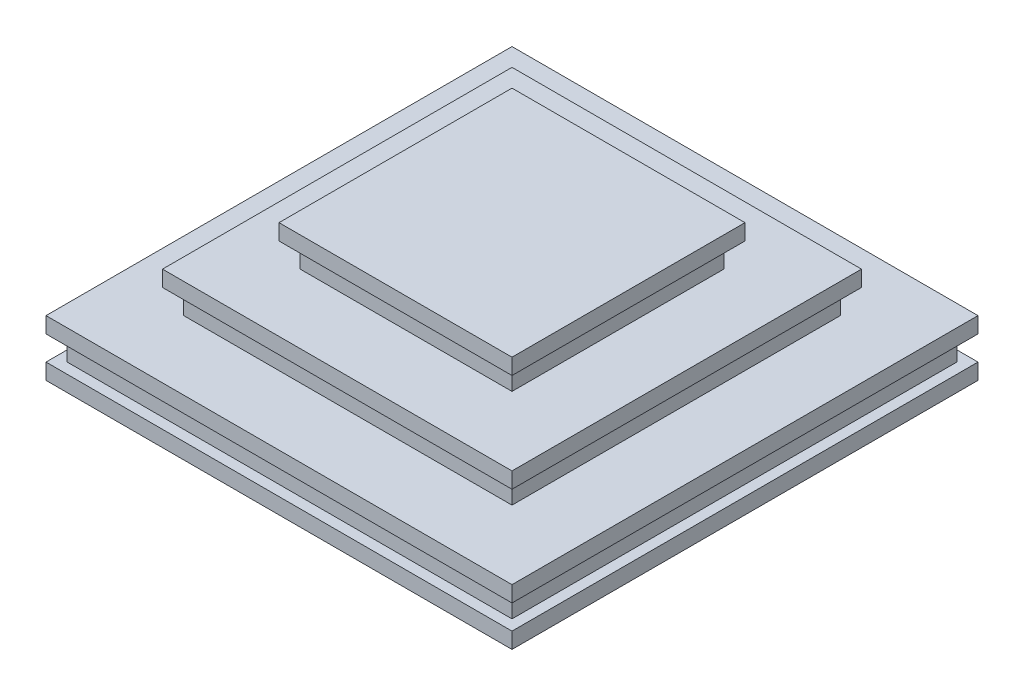
ISO-10303-21;
HEADER;
FILE_DESCRIPTION(('STEP AP214'),'2;1');
FILE_NAME('part.step','',(''),(''),'','','');
FILE_SCHEMA(('AUTOMOTIVE_DESIGN { 1 0 10303 214 1 1 1 1 }'));
ENDSEC;
DATA;
#1=APPLICATION_CONTEXT('core data for automotive mechanical design processes');
#2=APPLICATION_PROTOCOL_DEFINITION('international standard','automotive_design',2000,#1);
#3=PRODUCT_CONTEXT('',#1,'mechanical');
#4=PRODUCT('Part','Part','',(#3));
#5=PRODUCT_RELATED_PRODUCT_CATEGORY('part','',(#4));
#6=PRODUCT_DEFINITION_FORMATION('','',#4);
#7=PRODUCT_DEFINITION_CONTEXT('part definition',#1,'design');
#8=PRODUCT_DEFINITION('design','',#6,#7);
#9=PRODUCT_DEFINITION_SHAPE('','',#8);
#10=(LENGTH_UNIT() NAMED_UNIT(*) SI_UNIT(.MILLI.,.METRE.));
#11=(NAMED_UNIT(*) PLANE_ANGLE_UNIT() SI_UNIT($,.RADIAN.));
#12=(NAMED_UNIT(*) SI_UNIT($,.STERADIAN.) SOLID_ANGLE_UNIT());
#13=UNCERTAINTY_MEASURE_WITH_UNIT(LENGTH_MEASURE(1.E-05),#10,'distance_accuracy_value','');
#14=(GEOMETRIC_REPRESENTATION_CONTEXT(3) GLOBAL_UNCERTAINTY_ASSIGNED_CONTEXT((#13)) GLOBAL_UNIT_ASSIGNED_CONTEXT((#10,
#11,#12)) REPRESENTATION_CONTEXT('',''));
#15=CARTESIAN_POINT('',(0.,0.,0.));
#16=DIRECTION('',(0.,0.,1.));
#17=DIRECTION('',(1.,0.,0.));
#18=AXIS2_PLACEMENT_3D('',#15,#16,#17);
#19=CARTESIAN_POINT('',(-22.,1.5,-22.));
#20=DIRECTION('',(0.,0.,-1.));
#21=DIRECTION('',(-1.,0.,0.));
#22=AXIS2_PLACEMENT_3D('',#19,#20,#21);
#23=PLANE('',#22);
#24=DIRECTION('',(1.,0.,0.));
#25=VECTOR('',#24,1.);
#26=CARTESIAN_POINT('',(-22.,0.,-22.));
#27=LINE('',#26,#25);
#28=CARTESIAN_POINT('',(-22.,0.,-22.));
#29=VERTEX_POINT('',#28);
#30=CARTESIAN_POINT('',(22.,0.,-22.));
#31=VERTEX_POINT('',#30);
#32=EDGE_CURVE('E416',#29,#31,#27,.T.);
#33=ORIENTED_EDGE('',*,*,#32,.F.);
#34=DIRECTION('',(0.,-1.,0.));
#35=VECTOR('',#34,1.);
#36=CARTESIAN_POINT('',(-22.,1.5,-22.));
#37=LINE('',#36,#35);
#38=CARTESIAN_POINT('',(-22.,1.5,-22.));
#39=VERTEX_POINT('',#38);
#40=EDGE_CURVE('E11',#39,#29,#37,.T.);
#41=ORIENTED_EDGE('',*,*,#40,.F.);
#42=DIRECTION('',(1.,0.,0.));
#43=VECTOR('',#42,1.);
#44=CARTESIAN_POINT('',(-22.,1.5,-22.));
#45=LINE('',#44,#43);
#46=CARTESIAN_POINT('',(22.,1.5,-22.));
#47=VERTEX_POINT('',#46);
#48=EDGE_CURVE('E417',#39,#47,#45,.T.);
#49=ORIENTED_EDGE('',*,*,#48,.T.);
#50=DIRECTION('',(0.,-1.,0.));
#51=VECTOR('',#50,1.);
#52=CARTESIAN_POINT('',(22.,1.5,-22.));
#53=LINE('',#52,#51);
#54=EDGE_CURVE('E42',#47,#31,#53,.T.);
#55=ORIENTED_EDGE('',*,*,#54,.T.);
#56=EDGE_LOOP('',(#33,#41,#49,#55));
#57=FACE_BOUND('',#56,.T.);
#58=ADVANCED_FACE('F39',(#57),#23,.T.);
#59=CARTESIAN_POINT('',(-22.,1.5,-22.));
#60=DIRECTION('',(1.,0.,0.));
#61=DIRECTION('',(0.,0.,-1.));
#62=AXIS2_PLACEMENT_3D('',#59,#60,#61);
#63=PLANE('',#62);
#64=DIRECTION('',(0.,0.,1.));
#65=VECTOR('',#64,1.);
#66=CARTESIAN_POINT('',(-22.,0.,-22.));
#67=LINE('',#66,#65);
#68=CARTESIAN_POINT('',(-22.,0.,22.));
#69=VERTEX_POINT('',#68);
#70=EDGE_CURVE('E421',#29,#69,#67,.T.);
#71=ORIENTED_EDGE('',*,*,#70,.T.);
#72=DIRECTION('',(0.,-1.,0.));
#73=VECTOR('',#72,1.);
#74=CARTESIAN_POINT('',(-22.,1.5,22.));
#75=LINE('',#74,#73);
#76=CARTESIAN_POINT('',(-22.,1.5,22.));
#77=VERTEX_POINT('',#76);
#78=EDGE_CURVE('E47',#77,#69,#75,.T.);
#79=ORIENTED_EDGE('',*,*,#78,.F.);
#80=DIRECTION('',(0.,0.,1.));
#81=VECTOR('',#80,1.);
#82=CARTESIAN_POINT('',(-22.,1.5,-22.));
#83=LINE('',#82,#81);
#84=EDGE_CURVE('E426',#39,#77,#83,.T.);
#85=ORIENTED_EDGE('',*,*,#84,.F.);
#86=ORIENTED_EDGE('',*,*,#40,.T.);
#87=EDGE_LOOP('',(#71,#79,#85,#86));
#88=FACE_BOUND('',#87,.T.);
#89=ADVANCED_FACE('F453',(#88),#63,.F.);
#90=CARTESIAN_POINT('',(-22.,1.5,22.));
#91=DIRECTION('',(0.,0.,-1.));
#92=DIRECTION('',(-1.,0.,0.));
#93=AXIS2_PLACEMENT_3D('',#90,#91,#92);
#94=PLANE('',#93);
#95=DIRECTION('',(1.,0.,0.));
#96=VECTOR('',#95,1.);
#97=CARTESIAN_POINT('',(-22.,0.,22.));
#98=LINE('',#97,#96);
#99=CARTESIAN_POINT('',(22.,0.,22.));
#100=VERTEX_POINT('',#99);
#101=EDGE_CURVE('E433',#69,#100,#98,.T.);
#102=ORIENTED_EDGE('',*,*,#101,.T.);
#103=DIRECTION('',(0.,-1.,0.));
#104=VECTOR('',#103,1.);
#105=CARTESIAN_POINT('',(22.,1.5,22.));
#106=LINE('',#105,#104);
#107=CARTESIAN_POINT('',(22.,1.5,22.));
#108=VERTEX_POINT('',#107);
#109=EDGE_CURVE('E438',#108,#100,#106,.T.);
#110=ORIENTED_EDGE('',*,*,#109,.F.);
#111=DIRECTION('',(1.,0.,0.));
#112=VECTOR('',#111,1.);
#113=CARTESIAN_POINT('',(-22.,1.5,22.));
#114=LINE('',#113,#112);
#115=EDGE_CURVE('E424',#77,#108,#114,.T.);
#116=ORIENTED_EDGE('',*,*,#115,.F.);
#117=ORIENTED_EDGE('',*,*,#78,.T.);
#118=EDGE_LOOP('',(#102,#110,#116,#117));
#119=FACE_BOUND('',#118,.T.);
#120=ADVANCED_FACE('F457',(#119),#94,.F.);
#121=CARTESIAN_POINT('',(22.,1.5,-22.));
#122=DIRECTION('',(1.,0.,0.));
#123=DIRECTION('',(0.,0.,-1.));
#124=AXIS2_PLACEMENT_3D('',#121,#122,#123);
#125=PLANE('',#124);
#126=DIRECTION('',(0.,0.,1.));
#127=VECTOR('',#126,1.);
#128=CARTESIAN_POINT('',(22.,0.,-22.));
#129=LINE('',#128,#127);
#130=EDGE_CURVE('E430',#31,#100,#129,.T.);
#131=ORIENTED_EDGE('',*,*,#130,.F.);
#132=ORIENTED_EDGE('',*,*,#54,.F.);
#133=DIRECTION('',(0.,0.,1.));
#134=VECTOR('',#133,1.);
#135=CARTESIAN_POINT('',(22.,1.5,-22.));
#136=LINE('',#135,#134);
#137=EDGE_CURVE('E420',#47,#108,#136,.T.);
#138=ORIENTED_EDGE('',*,*,#137,.T.);
#139=ORIENTED_EDGE('',*,*,#109,.T.);
#140=EDGE_LOOP('',(#131,#132,#138,#139));
#141=FACE_BOUND('',#140,.T.);
#142=ADVANCED_FACE('F446',(#141),#125,.T.);
#143=CARTESIAN_POINT('',(0.,1.5,0.));
#144=DIRECTION('',(0.,-1.,0.));
#145=DIRECTION('',(0.,0.,-1.));
#146=AXIS2_PLACEMENT_3D('',#143,#144,#145);
#147=PLANE('',#146);
#148=DIRECTION('',(0.,0.,1.));
#149=VECTOR('',#148,1.);
#150=CARTESIAN_POINT('',(-21.,1.5,0.));
#151=LINE('',#150,#149);
#152=CARTESIAN_POINT('',(-21.,1.5,-21.));
#153=VERTEX_POINT('',#152);
#154=CARTESIAN_POINT('',(-21.,1.5,21.));
#155=VERTEX_POINT('',#154);
#156=EDGE_CURVE('E411',#153,#155,#151,.T.);
#157=ORIENTED_EDGE('',*,*,#156,.F.);
#158=DIRECTION('',(1.,0.,0.));
#159=VECTOR('',#158,1.);
#160=CARTESIAN_POINT('',(0.,1.5,-21.));
#161=LINE('',#160,#159);
#162=CARTESIAN_POINT('',(21.,1.5,-21.));
#163=VERTEX_POINT('',#162);
#164=EDGE_CURVE('E413',#153,#163,#161,.T.);
#165=ORIENTED_EDGE('',*,*,#164,.T.);
#166=DIRECTION('',(0.,0.,1.));
#167=VECTOR('',#166,1.);
#168=CARTESIAN_POINT('',(21.,1.5,0.));
#169=LINE('',#168,#167);
#170=CARTESIAN_POINT('',(21.,1.5,21.));
#171=VERTEX_POINT('',#170);
#172=EDGE_CURVE('E398',#163,#171,#169,.T.);
#173=ORIENTED_EDGE('',*,*,#172,.T.);
#174=DIRECTION('',(1.,0.,0.));
#175=VECTOR('',#174,1.);
#176=CARTESIAN_POINT('',(0.,1.5,21.));
#177=LINE('',#176,#175);
#178=EDGE_CURVE('E408',#155,#171,#177,.T.);
#179=ORIENTED_EDGE('',*,*,#178,.F.);
#180=EDGE_LOOP('',(#157,#165,#173,#179));
#181=FACE_BOUND('',#180,.T.);
#182=ORIENTED_EDGE('',*,*,#48,.F.);
#183=ORIENTED_EDGE('',*,*,#84,.T.);
#184=ORIENTED_EDGE('',*,*,#115,.T.);
#185=ORIENTED_EDGE('',*,*,#137,.F.);
#186=EDGE_LOOP('',(#182,#183,#184,#185));
#187=FACE_BOUND('',#186,.T.);
#188=ADVANCED_FACE('F459',(#181,#187),#147,.F.);
#189=CARTESIAN_POINT('',(0.,0.,0.));
#190=DIRECTION('',(0.,-1.,0.));
#191=DIRECTION('',(0.,0.,-1.));
#192=AXIS2_PLACEMENT_3D('',#189,#190,#191);
#193=PLANE('',#192);
#194=ORIENTED_EDGE('',*,*,#32,.T.);
#195=ORIENTED_EDGE('',*,*,#130,.T.);
#196=ORIENTED_EDGE('',*,*,#101,.F.);
#197=ORIENTED_EDGE('',*,*,#70,.F.);
#198=EDGE_LOOP('',(#194,#195,#196,#197));
#199=FACE_BOUND('',#198,.T.);
#200=ADVANCED_FACE('F450',(#199),#193,.T.);
#201=CARTESIAN_POINT('',(-21.,3.8,-21.));
#202=DIRECTION('',(0.,0.,-1.));
#203=DIRECTION('',(-1.,0.,0.));
#204=AXIS2_PLACEMENT_3D('',#201,#202,#203);
#205=PLANE('',#204);
#206=ORIENTED_EDGE('',*,*,#164,.F.);
#207=DIRECTION('',(0.,-1.,0.));
#208=VECTOR('',#207,1.);
#209=CARTESIAN_POINT('',(-21.,3.8,-21.));
#210=LINE('',#209,#208);
#211=CARTESIAN_POINT('',(-21.,3.8,-21.));
#212=VERTEX_POINT('',#211);
#213=EDGE_CURVE('E395',#212,#153,#210,.T.);
#214=ORIENTED_EDGE('',*,*,#213,.F.);
#215=DIRECTION('',(1.,0.,0.));
#216=VECTOR('',#215,1.);
#217=CARTESIAN_POINT('',(-21.,3.8,-21.));
#218=LINE('',#217,#216);
#219=CARTESIAN_POINT('',(21.,3.8,-21.));
#220=VERTEX_POINT('',#219);
#221=EDGE_CURVE('E378',#212,#220,#218,.T.);
#222=ORIENTED_EDGE('',*,*,#221,.T.);
#223=DIRECTION('',(0.,-1.,0.));
#224=VECTOR('',#223,1.);
#225=CARTESIAN_POINT('',(21.,3.8,-21.));
#226=LINE('',#225,#224);
#227=EDGE_CURVE('E394',#220,#163,#226,.T.);
#228=ORIENTED_EDGE('',*,*,#227,.T.);
#229=EDGE_LOOP('',(#206,#214,#222,#228));
#230=FACE_BOUND('',#229,.T.);
#231=ADVANCED_FACE('F467',(#230),#205,.T.);
#232=CARTESIAN_POINT('',(-21.,3.8,-21.));
#233=DIRECTION('',(1.,0.,0.));
#234=DIRECTION('',(0.,0.,-1.));
#235=AXIS2_PLACEMENT_3D('',#232,#233,#234);
#236=PLANE('',#235);
#237=ORIENTED_EDGE('',*,*,#213,.T.);
#238=ORIENTED_EDGE('',*,*,#156,.T.);
#239=DIRECTION('',(0.,-1.,0.));
#240=VECTOR('',#239,1.);
#241=CARTESIAN_POINT('',(-21.,3.8,21.));
#242=LINE('',#241,#240);
#243=CARTESIAN_POINT('',(-21.,3.8,21.));
#244=VERTEX_POINT('',#243);
#245=EDGE_CURVE('E399',#244,#155,#242,.T.);
#246=ORIENTED_EDGE('',*,*,#245,.F.);
#247=DIRECTION('',(0.,0.,1.));
#248=VECTOR('',#247,1.);
#249=CARTESIAN_POINT('',(-21.,3.8,-21.));
#250=LINE('',#249,#248);
#251=EDGE_CURVE('E392',#212,#244,#250,.T.);
#252=ORIENTED_EDGE('',*,*,#251,.F.);
#253=EDGE_LOOP('',(#237,#238,#246,#252));
#254=FACE_BOUND('',#253,.T.);
#255=ADVANCED_FACE('F507',(#254),#236,.F.);
#256=CARTESIAN_POINT('',(-21.,3.8,21.));
#257=DIRECTION('',(0.,0.,-1.));
#258=DIRECTION('',(-1.,0.,0.));
#259=AXIS2_PLACEMENT_3D('',#256,#257,#258);
#260=PLANE('',#259);
#261=ORIENTED_EDGE('',*,*,#245,.T.);
#262=ORIENTED_EDGE('',*,*,#178,.T.);
#263=DIRECTION('',(0.,-1.,0.));
#264=VECTOR('',#263,1.);
#265=CARTESIAN_POINT('',(21.,3.8,21.));
#266=LINE('',#265,#264);
#267=CARTESIAN_POINT('',(21.,3.8,21.));
#268=VERTEX_POINT('',#267);
#269=EDGE_CURVE('E402',#268,#171,#266,.T.);
#270=ORIENTED_EDGE('',*,*,#269,.F.);
#271=DIRECTION('',(1.,0.,0.));
#272=VECTOR('',#271,1.);
#273=CARTESIAN_POINT('',(-21.,3.8,21.));
#274=LINE('',#273,#272);
#275=EDGE_CURVE('E390',#244,#268,#274,.T.);
#276=ORIENTED_EDGE('',*,*,#275,.F.);
#277=EDGE_LOOP('',(#261,#262,#270,#276));
#278=FACE_BOUND('',#277,.T.);
#279=ADVANCED_FACE('F516',(#278),#260,.F.);
#280=CARTESIAN_POINT('',(21.,3.8,-21.));
#281=DIRECTION('',(1.,0.,0.));
#282=DIRECTION('',(0.,0.,-1.));
#283=AXIS2_PLACEMENT_3D('',#280,#281,#282);
#284=PLANE('',#283);
#285=ORIENTED_EDGE('',*,*,#172,.F.);
#286=ORIENTED_EDGE('',*,*,#227,.F.);
#287=DIRECTION('',(0.,0.,1.));
#288=VECTOR('',#287,1.);
#289=CARTESIAN_POINT('',(21.,3.8,-21.));
#290=LINE('',#289,#288);
#291=EDGE_CURVE('E387',#220,#268,#290,.T.);
#292=ORIENTED_EDGE('',*,*,#291,.T.);
#293=ORIENTED_EDGE('',*,*,#269,.T.);
#294=EDGE_LOOP('',(#285,#286,#292,#293));
#295=FACE_BOUND('',#294,.T.);
#296=ADVANCED_FACE('F526',(#295),#284,.T.);
#297=CARTESIAN_POINT('',(0.,3.8,0.));
#298=DIRECTION('',(0.,-1.,0.));
#299=DIRECTION('',(0.,0.,-1.));
#300=AXIS2_PLACEMENT_3D('',#297,#298,#299);
#301=PLANE('',#300);
#302=DIRECTION('',(1.,0.,0.));
#303=VECTOR('',#302,1.);
#304=CARTESIAN_POINT('',(-22.,3.8,-22.));
#305=LINE('',#304,#303);
#306=CARTESIAN_POINT('',(-22.,3.8,-22.));
#307=VERTEX_POINT('',#306);
#308=CARTESIAN_POINT('',(22.,3.8,-22.));
#309=VERTEX_POINT('',#308);
#310=EDGE_CURVE('E346',#307,#309,#305,.T.);
#311=ORIENTED_EDGE('',*,*,#310,.T.);
#312=DIRECTION('',(0.,0.,1.));
#313=VECTOR('',#312,1.);
#314=CARTESIAN_POINT('',(22.,3.8,-22.));
#315=LINE('',#314,#313);
#316=CARTESIAN_POINT('',(22.,3.8,22.));
#317=VERTEX_POINT('',#316);
#318=EDGE_CURVE('E369',#309,#317,#315,.T.);
#319=ORIENTED_EDGE('',*,*,#318,.T.);
#320=DIRECTION('',(1.,0.,0.));
#321=VECTOR('',#320,1.);
#322=CARTESIAN_POINT('',(-22.,3.8,22.));
#323=LINE('',#322,#321);
#324=CARTESIAN_POINT('',(-22.,3.8,22.));
#325=VERTEX_POINT('',#324);
#326=EDGE_CURVE('E372',#325,#317,#323,.T.);
#327=ORIENTED_EDGE('',*,*,#326,.F.);
#328=DIRECTION('',(0.,0.,1.));
#329=VECTOR('',#328,1.);
#330=CARTESIAN_POINT('',(-22.,3.8,-22.));
#331=LINE('',#330,#329);
#332=EDGE_CURVE('E359',#307,#325,#331,.T.);
#333=ORIENTED_EDGE('',*,*,#332,.F.);
#334=EDGE_LOOP('',(#311,#319,#327,#333));
#335=FACE_BOUND('',#334,.T.);
#336=ORIENTED_EDGE('',*,*,#221,.F.);
#337=ORIENTED_EDGE('',*,*,#251,.T.);
#338=ORIENTED_EDGE('',*,*,#275,.T.);
#339=ORIENTED_EDGE('',*,*,#291,.F.);
#340=EDGE_LOOP('',(#336,#337,#338,#339));
#341=FACE_BOUND('',#340,.T.);
#342=ADVANCED_FACE('F536',(#335,#341),#301,.T.);
#343=CARTESIAN_POINT('',(-22.,5.3,-22.));
#344=DIRECTION('',(0.,0.,-1.));
#345=DIRECTION('',(-1.,0.,0.));
#346=AXIS2_PLACEMENT_3D('',#343,#344,#345);
#347=PLANE('',#346);
#348=ORIENTED_EDGE('',*,*,#310,.F.);
#349=DIRECTION('',(0.,-1.,0.));
#350=VECTOR('',#349,1.);
#351=CARTESIAN_POINT('',(-22.,5.3,-22.));
#352=LINE('',#351,#350);
#353=CARTESIAN_POINT('',(-22.,5.3,-22.));
#354=VERTEX_POINT('',#353);
#355=EDGE_CURVE('E376',#354,#307,#352,.T.);
#356=ORIENTED_EDGE('',*,*,#355,.F.);
#357=DIRECTION('',(1.,0.,0.));
#358=VECTOR('',#357,1.);
#359=CARTESIAN_POINT('',(-22.,5.3,-22.));
#360=LINE('',#359,#358);
#361=CARTESIAN_POINT('',(22.,5.3,-22.));
#362=VERTEX_POINT('',#361);
#363=EDGE_CURVE('E355',#354,#362,#360,.T.);
#364=ORIENTED_EDGE('',*,*,#363,.T.);
#365=DIRECTION('',(0.,-1.,0.));
#366=VECTOR('',#365,1.);
#367=CARTESIAN_POINT('',(22.,5.3,-22.));
#368=LINE('',#367,#366);
#369=EDGE_CURVE('E366',#362,#309,#368,.T.);
#370=ORIENTED_EDGE('',*,*,#369,.T.);
#371=EDGE_LOOP('',(#348,#356,#364,#370));
#372=FACE_BOUND('',#371,.T.);
#373=ADVANCED_FACE('F546',(#372),#347,.T.);
#374=CARTESIAN_POINT('',(-22.,5.3,-22.));
#375=DIRECTION('',(1.,0.,0.));
#376=DIRECTION('',(0.,0.,-1.));
#377=AXIS2_PLACEMENT_3D('',#374,#375,#376);
#378=PLANE('',#377);
#379=ORIENTED_EDGE('',*,*,#332,.T.);
#380=DIRECTION('',(0.,-1.,0.));
#381=VECTOR('',#380,1.);
#382=CARTESIAN_POINT('',(-22.,5.3,22.));
#383=LINE('',#382,#381);
#384=CARTESIAN_POINT('',(-22.,5.3,22.));
#385=VERTEX_POINT('',#384);
#386=EDGE_CURVE('E379',#385,#325,#383,.T.);
#387=ORIENTED_EDGE('',*,*,#386,.F.);
#388=DIRECTION('',(0.,0.,1.));
#389=VECTOR('',#388,1.);
#390=CARTESIAN_POINT('',(-22.,5.3,-22.));
#391=LINE('',#390,#389);
#392=EDGE_CURVE('E364',#354,#385,#391,.T.);
#393=ORIENTED_EDGE('',*,*,#392,.F.);
#394=ORIENTED_EDGE('',*,*,#355,.T.);
#395=EDGE_LOOP('',(#379,#387,#393,#394));
#396=FACE_BOUND('',#395,.T.);
#397=ADVANCED_FACE('F556',(#396),#378,.F.);
#398=CARTESIAN_POINT('',(-22.,5.3,22.));
#399=DIRECTION('',(0.,0.,-1.));
#400=DIRECTION('',(-1.,0.,0.));
#401=AXIS2_PLACEMENT_3D('',#398,#399,#400);
#402=PLANE('',#401);
#403=ORIENTED_EDGE('',*,*,#326,.T.);
#404=DIRECTION('',(0.,-1.,0.));
#405=VECTOR('',#404,1.);
#406=CARTESIAN_POINT('',(22.,5.3,22.));
#407=LINE('',#406,#405);
#408=CARTESIAN_POINT('',(22.,5.3,22.));
#409=VERTEX_POINT('',#408);
#410=EDGE_CURVE('E382',#409,#317,#407,.T.);
#411=ORIENTED_EDGE('',*,*,#410,.F.);
#412=DIRECTION('',(1.,0.,0.));
#413=VECTOR('',#412,1.);
#414=CARTESIAN_POINT('',(-22.,5.3,22.));
#415=LINE('',#414,#413);
#416=EDGE_CURVE('E362',#385,#409,#415,.T.);
#417=ORIENTED_EDGE('',*,*,#416,.F.);
#418=ORIENTED_EDGE('',*,*,#386,.T.);
#419=EDGE_LOOP('',(#403,#411,#417,#418));
#420=FACE_BOUND('',#419,.T.);
#421=ADVANCED_FACE('F566',(#420),#402,.F.);
#422=CARTESIAN_POINT('',(22.,5.3,-22.));
#423=DIRECTION('',(1.,0.,0.));
#424=DIRECTION('',(0.,0.,-1.));
#425=AXIS2_PLACEMENT_3D('',#422,#423,#424);
#426=PLANE('',#425);
#427=ORIENTED_EDGE('',*,*,#318,.F.);
#428=ORIENTED_EDGE('',*,*,#369,.F.);
#429=DIRECTION('',(0.,0.,1.));
#430=VECTOR('',#429,1.);
#431=CARTESIAN_POINT('',(22.,5.3,-22.));
#432=LINE('',#431,#430);
#433=EDGE_CURVE('E358',#362,#409,#432,.T.);
#434=ORIENTED_EDGE('',*,*,#433,.T.);
#435=ORIENTED_EDGE('',*,*,#410,.T.);
#436=EDGE_LOOP('',(#427,#428,#434,#435));
#437=FACE_BOUND('',#436,.T.);
#438=ADVANCED_FACE('F576',(#437),#426,.T.);
#439=CARTESIAN_POINT('',(0.,5.3,0.));
#440=DIRECTION('',(0.,-1.,0.));
#441=DIRECTION('',(0.,0.,-1.));
#442=AXIS2_PLACEMENT_3D('',#439,#440,#441);
#443=PLANE('',#442);
#444=DIRECTION('',(0.,0.,1.));
#445=VECTOR('',#444,1.);
#446=CARTESIAN_POINT('',(-15.5,5.3,-15.5));
#447=LINE('',#446,#445);
#448=CARTESIAN_POINT('',(-15.5,5.3,-15.5));
#449=VERTEX_POINT('',#448);
#450=CARTESIAN_POINT('',(-15.5,5.3,15.5));
#451=VERTEX_POINT('',#450);
#452=EDGE_CURVE('E327',#449,#451,#447,.T.);
#453=ORIENTED_EDGE('',*,*,#452,.F.);
#454=DIRECTION('',(1.,0.,0.));
#455=VECTOR('',#454,1.);
#456=CARTESIAN_POINT('',(-15.5,5.3,-15.5));
#457=LINE('',#456,#455);
#458=CARTESIAN_POINT('',(15.5,5.3,-15.5));
#459=VERTEX_POINT('',#458);
#460=EDGE_CURVE('E316',#449,#459,#457,.T.);
#461=ORIENTED_EDGE('',*,*,#460,.T.);
#462=DIRECTION('',(0.,0.,1.));
#463=VECTOR('',#462,1.);
#464=CARTESIAN_POINT('',(15.5,5.3,-15.5));
#465=LINE('',#464,#463);
#466=CARTESIAN_POINT('',(15.5,5.3,15.5));
#467=VERTEX_POINT('',#466);
#468=EDGE_CURVE('E336',#459,#467,#465,.T.);
#469=ORIENTED_EDGE('',*,*,#468,.T.);
#470=DIRECTION('',(1.,0.,0.));
#471=VECTOR('',#470,1.);
#472=CARTESIAN_POINT('',(-15.5,5.3,15.5));
#473=LINE('',#472,#471);
#474=EDGE_CURVE('E338',#451,#467,#473,.T.);
#475=ORIENTED_EDGE('',*,*,#474,.F.);
#476=EDGE_LOOP('',(#453,#461,#469,#475));
#477=FACE_BOUND('',#476,.T.);
#478=ORIENTED_EDGE('',*,*,#363,.F.);
#479=ORIENTED_EDGE('',*,*,#392,.T.);
#480=ORIENTED_EDGE('',*,*,#416,.T.);
#481=ORIENTED_EDGE('',*,*,#433,.F.);
#482=EDGE_LOOP('',(#478,#479,#480,#481));
#483=FACE_BOUND('',#482,.T.);
#484=ADVANCED_FACE('F586',(#477,#483),#443,.F.);
#485=CARTESIAN_POINT('',(-15.5,7.6,-15.5));
#486=DIRECTION('',(0.,0.,-1.));
#487=DIRECTION('',(-1.,0.,0.));
#488=AXIS2_PLACEMENT_3D('',#485,#486,#487);
#489=PLANE('',#488);
#490=ORIENTED_EDGE('',*,*,#460,.F.);
#491=DIRECTION('',(0.,-1.,0.));
#492=VECTOR('',#491,1.);
#493=CARTESIAN_POINT('',(-15.5,7.6,-15.5));
#494=LINE('',#493,#492);
#495=CARTESIAN_POINT('',(-15.5,7.6,-15.5));
#496=VERTEX_POINT('',#495);
#497=EDGE_CURVE('E343',#496,#449,#494,.T.);
#498=ORIENTED_EDGE('',*,*,#497,.F.);
#499=DIRECTION('',(1.,0.,0.));
#500=VECTOR('',#499,1.);
#501=CARTESIAN_POINT('',(-15.5,7.6,-15.5));
#502=LINE('',#501,#500);
#503=CARTESIAN_POINT('',(15.5,7.6,-15.5));
#504=VERTEX_POINT('',#503);
#505=EDGE_CURVE('E323',#496,#504,#502,.T.);
#506=ORIENTED_EDGE('',*,*,#505,.T.);
#507=DIRECTION('',(0.,-1.,0.));
#508=VECTOR('',#507,1.);
#509=CARTESIAN_POINT('',(15.5,7.6,-15.5));
#510=LINE('',#509,#508);
#511=EDGE_CURVE('E334',#504,#459,#510,.T.);
#512=ORIENTED_EDGE('',*,*,#511,.T.);
#513=EDGE_LOOP('',(#490,#498,#506,#512));
#514=FACE_BOUND('',#513,.T.);
#515=ADVANCED_FACE('F596',(#514),#489,.T.);
#516=CARTESIAN_POINT('',(-15.5,7.6,-15.5));
#517=DIRECTION('',(1.,0.,0.));
#518=DIRECTION('',(0.,0.,-1.));
#519=AXIS2_PLACEMENT_3D('',#516,#517,#518);
#520=PLANE('',#519);
#521=ORIENTED_EDGE('',*,*,#452,.T.);
#522=DIRECTION('',(0.,-1.,0.));
#523=VECTOR('',#522,1.);
#524=CARTESIAN_POINT('',(-15.5,7.6,15.5));
#525=LINE('',#524,#523);
#526=CARTESIAN_POINT('',(-15.5,7.6,15.5));
#527=VERTEX_POINT('',#526);
#528=EDGE_CURVE('E347',#527,#451,#525,.T.);
#529=ORIENTED_EDGE('',*,*,#528,.F.);
#530=DIRECTION('',(0.,0.,1.));
#531=VECTOR('',#530,1.);
#532=CARTESIAN_POINT('',(-15.5,7.6,-15.5));
#533=LINE('',#532,#531);
#534=EDGE_CURVE('E332',#496,#527,#533,.T.);
#535=ORIENTED_EDGE('',*,*,#534,.F.);
#536=ORIENTED_EDGE('',*,*,#497,.T.);
#537=EDGE_LOOP('',(#521,#529,#535,#536));
#538=FACE_BOUND('',#537,.T.);
#539=ADVANCED_FACE('F606',(#538),#520,.F.);
#540=CARTESIAN_POINT('',(-15.5,7.6,15.5));
#541=DIRECTION('',(0.,0.,-1.));
#542=DIRECTION('',(-1.,0.,0.));
#543=AXIS2_PLACEMENT_3D('',#540,#541,#542);
#544=PLANE('',#543);
#545=ORIENTED_EDGE('',*,*,#474,.T.);
#546=DIRECTION('',(0.,-1.,0.));
#547=VECTOR('',#546,1.);
#548=CARTESIAN_POINT('',(15.5,7.6,15.5));
#549=LINE('',#548,#547);
#550=CARTESIAN_POINT('',(15.5,7.6,15.5));
#551=VERTEX_POINT('',#550);
#552=EDGE_CURVE('E350',#551,#467,#549,.T.);
#553=ORIENTED_EDGE('',*,*,#552,.F.);
#554=DIRECTION('',(1.,0.,0.));
#555=VECTOR('',#554,1.);
#556=CARTESIAN_POINT('',(-15.5,7.6,15.5));
#557=LINE('',#556,#555);
#558=EDGE_CURVE('E330',#527,#551,#557,.T.);
#559=ORIENTED_EDGE('',*,*,#558,.F.);
#560=ORIENTED_EDGE('',*,*,#528,.T.);
#561=EDGE_LOOP('',(#545,#553,#559,#560));
#562=FACE_BOUND('',#561,.T.);
#563=ADVANCED_FACE('F616',(#562),#544,.F.);
#564=CARTESIAN_POINT('',(15.5,7.6,-15.5));
#565=DIRECTION('',(1.,0.,0.));
#566=DIRECTION('',(0.,0.,-1.));
#567=AXIS2_PLACEMENT_3D('',#564,#565,#566);
#568=PLANE('',#567);
#569=ORIENTED_EDGE('',*,*,#468,.F.);
#570=ORIENTED_EDGE('',*,*,#511,.F.);
#571=DIRECTION('',(0.,0.,1.));
#572=VECTOR('',#571,1.);
#573=CARTESIAN_POINT('',(15.5,7.6,-15.5));
#574=LINE('',#573,#572);
#575=EDGE_CURVE('E326',#504,#551,#574,.T.);
#576=ORIENTED_EDGE('',*,*,#575,.T.);
#577=ORIENTED_EDGE('',*,*,#552,.T.);
#578=EDGE_LOOP('',(#569,#570,#576,#577));
#579=FACE_BOUND('',#578,.T.);
#580=ADVANCED_FACE('F626',(#579),#568,.T.);
#581=CARTESIAN_POINT('',(0.,7.6,0.));
#582=DIRECTION('',(0.,-1.,0.));
#583=DIRECTION('',(0.,0.,-1.));
#584=AXIS2_PLACEMENT_3D('',#581,#582,#583);
#585=PLANE('',#584);
#586=DIRECTION('',(1.,0.,0.));
#587=VECTOR('',#586,1.);
#588=CARTESIAN_POINT('',(-16.5,7.6,-16.5));
#589=LINE('',#588,#587);
#590=CARTESIAN_POINT('',(-16.5,7.6,-16.5));
#591=VERTEX_POINT('',#590);
#592=CARTESIAN_POINT('',(16.5,7.6,-16.5));
#593=VERTEX_POINT('',#592);
#594=EDGE_CURVE('E286',#591,#593,#589,.T.);
#595=ORIENTED_EDGE('',*,*,#594,.T.);
#596=DIRECTION('',(0.,0.,1.));
#597=VECTOR('',#596,1.);
#598=CARTESIAN_POINT('',(16.5,7.6,-16.5));
#599=LINE('',#598,#597);
#600=CARTESIAN_POINT('',(16.5,7.6,16.5));
#601=VERTEX_POINT('',#600);
#602=EDGE_CURVE('E307',#593,#601,#599,.T.);
#603=ORIENTED_EDGE('',*,*,#602,.T.);
#604=DIRECTION('',(1.,0.,0.));
#605=VECTOR('',#604,1.);
#606=CARTESIAN_POINT('',(-16.5,7.6,16.5));
#607=LINE('',#606,#605);
#608=CARTESIAN_POINT('',(-16.5,7.6,16.5));
#609=VERTEX_POINT('',#608);
#610=EDGE_CURVE('E310',#609,#601,#607,.T.);
#611=ORIENTED_EDGE('',*,*,#610,.F.);
#612=DIRECTION('',(0.,0.,1.));
#613=VECTOR('',#612,1.);
#614=CARTESIAN_POINT('',(-16.5,7.6,-16.5));
#615=LINE('',#614,#613);
#616=EDGE_CURVE('E297',#591,#609,#615,.T.);
#617=ORIENTED_EDGE('',*,*,#616,.F.);
#618=EDGE_LOOP('',(#595,#603,#611,#617));
#619=FACE_BOUND('',#618,.T.);
#620=ORIENTED_EDGE('',*,*,#505,.F.);
#621=ORIENTED_EDGE('',*,*,#534,.T.);
#622=ORIENTED_EDGE('',*,*,#558,.T.);
#623=ORIENTED_EDGE('',*,*,#575,.F.);
#624=EDGE_LOOP('',(#620,#621,#622,#623));
#625=FACE_BOUND('',#624,.T.);
#626=ADVANCED_FACE('F636',(#619,#625),#585,.T.);
#627=CARTESIAN_POINT('',(-16.5,9.1,-16.5));
#628=DIRECTION('',(0.,0.,-1.));
#629=DIRECTION('',(-1.,0.,0.));
#630=AXIS2_PLACEMENT_3D('',#627,#628,#629);
#631=PLANE('',#630);
#632=ORIENTED_EDGE('',*,*,#594,.F.);
#633=DIRECTION('',(0.,-1.,0.));
#634=VECTOR('',#633,1.);
#635=CARTESIAN_POINT('',(-16.5,9.1,-16.5));
#636=LINE('',#635,#634);
#637=CARTESIAN_POINT('',(-16.5,9.1,-16.5));
#638=VERTEX_POINT('',#637);
#639=EDGE_CURVE('E314',#638,#591,#636,.T.);
#640=ORIENTED_EDGE('',*,*,#639,.F.);
#641=DIRECTION('',(1.,0.,0.));
#642=VECTOR('',#641,1.);
#643=CARTESIAN_POINT('',(-16.5,9.1,-16.5));
#644=LINE('',#643,#642);
#645=CARTESIAN_POINT('',(16.5,9.1,-16.5));
#646=VERTEX_POINT('',#645);
#647=EDGE_CURVE('E293',#638,#646,#644,.T.);
#648=ORIENTED_EDGE('',*,*,#647,.T.);
#649=DIRECTION('',(0.,-1.,0.));
#650=VECTOR('',#649,1.);
#651=CARTESIAN_POINT('',(16.5,9.1,-16.5));
#652=LINE('',#651,#650);
#653=EDGE_CURVE('E304',#646,#593,#652,.T.);
#654=ORIENTED_EDGE('',*,*,#653,.T.);
#655=EDGE_LOOP('',(#632,#640,#648,#654));
#656=FACE_BOUND('',#655,.T.);
#657=ADVANCED_FACE('F646',(#656),#631,.T.);
#658=CARTESIAN_POINT('',(-16.5,9.1,-16.5));
#659=DIRECTION('',(1.,0.,0.));
#660=DIRECTION('',(0.,0.,-1.));
#661=AXIS2_PLACEMENT_3D('',#658,#659,#660);
#662=PLANE('',#661);
#663=ORIENTED_EDGE('',*,*,#616,.T.);
#664=DIRECTION('',(0.,-1.,0.));
#665=VECTOR('',#664,1.);
#666=CARTESIAN_POINT('',(-16.5,9.1,16.5));
#667=LINE('',#666,#665);
#668=CARTESIAN_POINT('',(-16.5,9.1,16.5));
#669=VERTEX_POINT('',#668);
#670=EDGE_CURVE('E317',#669,#609,#667,.T.);
#671=ORIENTED_EDGE('',*,*,#670,.F.);
#672=DIRECTION('',(0.,0.,1.));
#673=VECTOR('',#672,1.);
#674=CARTESIAN_POINT('',(-16.5,9.1,-16.5));
#675=LINE('',#674,#673);
#676=EDGE_CURVE('E302',#638,#669,#675,.T.);
#677=ORIENTED_EDGE('',*,*,#676,.F.);
#678=ORIENTED_EDGE('',*,*,#639,.T.);
#679=EDGE_LOOP('',(#663,#671,#677,#678));
#680=FACE_BOUND('',#679,.T.);
#681=ADVANCED_FACE('F656',(#680),#662,.F.);
#682=CARTESIAN_POINT('',(-16.5,9.1,16.5));
#683=DIRECTION('',(0.,0.,-1.));
#684=DIRECTION('',(-1.,0.,0.));
#685=AXIS2_PLACEMENT_3D('',#682,#683,#684);
#686=PLANE('',#685);
#687=ORIENTED_EDGE('',*,*,#610,.T.);
#688=DIRECTION('',(0.,-1.,0.));
#689=VECTOR('',#688,1.);
#690=CARTESIAN_POINT('',(16.5,9.1,16.5));
#691=LINE('',#690,#689);
#692=CARTESIAN_POINT('',(16.5,9.1,16.5));
#693=VERTEX_POINT('',#692);
#694=EDGE_CURVE('E320',#693,#601,#691,.T.);
#695=ORIENTED_EDGE('',*,*,#694,.F.);
#696=DIRECTION('',(1.,0.,0.));
#697=VECTOR('',#696,1.);
#698=CARTESIAN_POINT('',(-16.5,9.1,16.5));
#699=LINE('',#698,#697);
#700=EDGE_CURVE('E300',#669,#693,#699,.T.);
#701=ORIENTED_EDGE('',*,*,#700,.F.);
#702=ORIENTED_EDGE('',*,*,#670,.T.);
#703=EDGE_LOOP('',(#687,#695,#701,#702));
#704=FACE_BOUND('',#703,.T.);
#705=ADVANCED_FACE('F666',(#704),#686,.F.);
#706=CARTESIAN_POINT('',(16.5,9.1,-16.5));
#707=DIRECTION('',(1.,0.,0.));
#708=DIRECTION('',(0.,0.,-1.));
#709=AXIS2_PLACEMENT_3D('',#706,#707,#708);
#710=PLANE('',#709);
#711=ORIENTED_EDGE('',*,*,#602,.F.);
#712=ORIENTED_EDGE('',*,*,#653,.F.);
#713=DIRECTION('',(0.,0.,1.));
#714=VECTOR('',#713,1.);
#715=CARTESIAN_POINT('',(16.5,9.1,-16.5));
#716=LINE('',#715,#714);
#717=EDGE_CURVE('E296',#646,#693,#716,.T.);
#718=ORIENTED_EDGE('',*,*,#717,.T.);
#719=ORIENTED_EDGE('',*,*,#694,.T.);
#720=EDGE_LOOP('',(#711,#712,#718,#719));
#721=FACE_BOUND('',#720,.T.);
#722=ADVANCED_FACE('F676',(#721),#710,.T.);
#723=CARTESIAN_POINT('',(0.,9.1,0.));
#724=DIRECTION('',(0.,-1.,0.));
#725=DIRECTION('',(0.,0.,-1.));
#726=AXIS2_PLACEMENT_3D('',#723,#724,#725);
#727=PLANE('',#726);
#728=DIRECTION('',(0.,0.,1.));
#729=VECTOR('',#728,1.);
#730=CARTESIAN_POINT('',(-10.,9.1,-10.));
#731=LINE('',#730,#729);
#732=CARTESIAN_POINT('',(-10.,9.1,-10.));
#733=VERTEX_POINT('',#732);
#734=CARTESIAN_POINT('',(-10.,9.1,10.));
#735=VERTEX_POINT('',#734);
#736=EDGE_CURVE('E268',#733,#735,#731,.T.);
#737=ORIENTED_EDGE('',*,*,#736,.F.);
#738=DIRECTION('',(1.,0.,0.));
#739=VECTOR('',#738,1.);
#740=CARTESIAN_POINT('',(-10.,9.1,-10.));
#741=LINE('',#740,#739);
#742=CARTESIAN_POINT('',(10.,9.1,-10.));
#743=VERTEX_POINT('',#742);
#744=EDGE_CURVE('E55',#733,#743,#741,.T.);
#745=ORIENTED_EDGE('',*,*,#744,.T.);
#746=DIRECTION('',(0.,0.,1.));
#747=VECTOR('',#746,1.);
#748=CARTESIAN_POINT('',(10.,9.1,-10.));
#749=LINE('',#748,#747);
#750=CARTESIAN_POINT('',(10.,9.1,10.));
#751=VERTEX_POINT('',#750);
#752=EDGE_CURVE('E60',#743,#751,#749,.T.);
#753=ORIENTED_EDGE('',*,*,#752,.T.);
#754=DIRECTION('',(1.,0.,0.));
#755=VECTOR('',#754,1.);
#756=CARTESIAN_POINT('',(-10.,9.1,10.));
#757=LINE('',#756,#755);
#758=EDGE_CURVE('E278',#735,#751,#757,.T.);
#759=ORIENTED_EDGE('',*,*,#758,.F.);
#760=EDGE_LOOP('',(#737,#745,#753,#759));
#761=FACE_BOUND('',#760,.T.);
#762=ORIENTED_EDGE('',*,*,#647,.F.);
#763=ORIENTED_EDGE('',*,*,#676,.T.);
#764=ORIENTED_EDGE('',*,*,#700,.T.);
#765=ORIENTED_EDGE('',*,*,#717,.F.);
#766=EDGE_LOOP('',(#762,#763,#764,#765));
#767=FACE_BOUND('',#766,.T.);
#768=ADVANCED_FACE('F686',(#761,#767),#727,.F.);
#769=CARTESIAN_POINT('',(-10.,11.4,-10.));
#770=DIRECTION('',(0.,0.,-1.));
#771=DIRECTION('',(-1.,0.,0.));
#772=AXIS2_PLACEMENT_3D('',#769,#770,#771);
#773=PLANE('',#772);
#774=ORIENTED_EDGE('',*,*,#744,.F.);
#775=DIRECTION('',(0.,-1.,0.));
#776=VECTOR('',#775,1.);
#777=CARTESIAN_POINT('',(-10.,11.4,-10.));
#778=LINE('',#777,#776);
#779=CARTESIAN_POINT('',(-10.,11.4,-10.));
#780=VERTEX_POINT('',#779);
#781=EDGE_CURVE('E283',#780,#733,#778,.T.);
#782=ORIENTED_EDGE('',*,*,#781,.F.);
#783=DIRECTION('',(1.,0.,0.));
#784=VECTOR('',#783,1.);
#785=CARTESIAN_POINT('',(-10.,11.4,-10.));
#786=LINE('',#785,#784);
#787=CARTESIAN_POINT('',(10.,11.4,-10.));
#788=VERTEX_POINT('',#787);
#789=EDGE_CURVE('E264',#780,#788,#786,.T.);
#790=ORIENTED_EDGE('',*,*,#789,.T.);
#791=DIRECTION('',(0.,-1.,0.));
#792=VECTOR('',#791,1.);
#793=CARTESIAN_POINT('',(10.,11.4,-10.));
#794=LINE('',#793,#792);
#795=EDGE_CURVE('E275',#788,#743,#794,.T.);
#796=ORIENTED_EDGE('',*,*,#795,.T.);
#797=EDGE_LOOP('',(#774,#782,#790,#796));
#798=FACE_BOUND('',#797,.T.);
#799=ADVANCED_FACE('F696',(#798),#773,.T.);
#800=CARTESIAN_POINT('',(-10.,11.4,-10.));
#801=DIRECTION('',(1.,0.,0.));
#802=DIRECTION('',(0.,0.,-1.));
#803=AXIS2_PLACEMENT_3D('',#800,#801,#802);
#804=PLANE('',#803);
#805=ORIENTED_EDGE('',*,*,#736,.T.);
#806=DIRECTION('',(0.,-1.,0.));
#807=VECTOR('',#806,1.);
#808=CARTESIAN_POINT('',(-10.,11.4,10.));
#809=LINE('',#808,#807);
#810=CARTESIAN_POINT('',(-10.,11.4,10.));
#811=VERTEX_POINT('',#810);
#812=EDGE_CURVE('E287',#811,#735,#809,.T.);
#813=ORIENTED_EDGE('',*,*,#812,.F.);
#814=DIRECTION('',(0.,0.,1.));
#815=VECTOR('',#814,1.);
#816=CARTESIAN_POINT('',(-10.,11.4,-10.));
#817=LINE('',#816,#815);
#818=EDGE_CURVE('E273',#780,#811,#817,.T.);
#819=ORIENTED_EDGE('',*,*,#818,.F.);
#820=ORIENTED_EDGE('',*,*,#781,.T.);
#821=EDGE_LOOP('',(#805,#813,#819,#820));
#822=FACE_BOUND('',#821,.T.);
#823=ADVANCED_FACE('F705',(#822),#804,.F.);
#824=CARTESIAN_POINT('',(-10.,11.4,10.));
#825=DIRECTION('',(0.,0.,-1.));
#826=DIRECTION('',(-1.,0.,0.));
#827=AXIS2_PLACEMENT_3D('',#824,#825,#826);
#828=PLANE('',#827);
#829=ORIENTED_EDGE('',*,*,#758,.T.);
#830=DIRECTION('',(0.,-1.,0.));
#831=VECTOR('',#830,1.);
#832=CARTESIAN_POINT('',(10.,11.4,10.));
#833=LINE('',#832,#831);
#834=CARTESIAN_POINT('',(10.,11.4,10.));
#835=VERTEX_POINT('',#834);
#836=EDGE_CURVE('E290',#835,#751,#833,.T.);
#837=ORIENTED_EDGE('',*,*,#836,.F.);
#838=DIRECTION('',(1.,0.,0.));
#839=VECTOR('',#838,1.);
#840=CARTESIAN_POINT('',(-10.,11.4,10.));
#841=LINE('',#840,#839);
#842=EDGE_CURVE('E271',#811,#835,#841,.T.);
#843=ORIENTED_EDGE('',*,*,#842,.F.);
#844=ORIENTED_EDGE('',*,*,#812,.T.);
#845=EDGE_LOOP('',(#829,#837,#843,#844));
#846=FACE_BOUND('',#845,.T.);
#847=ADVANCED_FACE('F715',(#846),#828,.F.);
#848=CARTESIAN_POINT('',(10.,11.4,-10.));
#849=DIRECTION('',(1.,0.,0.));
#850=DIRECTION('',(0.,0.,-1.));
#851=AXIS2_PLACEMENT_3D('',#848,#849,#850);
#852=PLANE('',#851);
#853=ORIENTED_EDGE('',*,*,#752,.F.);
#854=ORIENTED_EDGE('',*,*,#795,.F.);
#855=DIRECTION('',(0.,0.,1.));
#856=VECTOR('',#855,1.);
#857=CARTESIAN_POINT('',(10.,11.4,-10.));
#858=LINE('',#857,#856);
#859=EDGE_CURVE('E267',#788,#835,#858,.T.);
#860=ORIENTED_EDGE('',*,*,#859,.T.);
#861=ORIENTED_EDGE('',*,*,#836,.T.);
#862=EDGE_LOOP('',(#853,#854,#860,#861));
#863=FACE_BOUND('',#862,.T.);
#864=ADVANCED_FACE('F725',(#863),#852,.T.);
#865=CARTESIAN_POINT('',(-11.,11.4,-11.));
#866=DIRECTION('',(-1.,0.,0.));
#867=DIRECTION('',(0.,0.,1.));
#868=AXIS2_PLACEMENT_3D('',#865,#866,#867);
#869=PLANE('',#868);
#870=DIRECTION('',(0.,0.,1.));
#871=VECTOR('',#870,1.);
#872=CARTESIAN_POINT('',(-11.,12.9,-11.));
#873=LINE('',#872,#871);
#874=CARTESIAN_POINT('',(-11.,12.9,-11.));
#875=VERTEX_POINT('',#874);
#876=CARTESIAN_POINT('',(-11.,12.9,11.));
#877=VERTEX_POINT('',#876);
#878=EDGE_CURVE('E254',#875,#877,#873,.T.);
#879=ORIENTED_EDGE('',*,*,#878,.F.);
#880=DIRECTION('',(0.,1.,0.));
#881=VECTOR('',#880,1.);
#882=CARTESIAN_POINT('',(-11.,11.4,-11.));
#883=LINE('',#882,#881);
#884=CARTESIAN_POINT('',(-11.,11.4,-11.));
#885=VERTEX_POINT('',#884);
#886=EDGE_CURVE('E245',#885,#875,#883,.T.);
#887=ORIENTED_EDGE('',*,*,#886,.F.);
#888=DIRECTION('',(0.,0.,1.));
#889=VECTOR('',#888,1.);
#890=CARTESIAN_POINT('',(-11.,11.4,-11.));
#891=LINE('',#890,#889);
#892=CARTESIAN_POINT('',(-11.,11.4,11.));
#893=VERTEX_POINT('',#892);
#894=EDGE_CURVE('E239',#885,#893,#891,.T.);
#895=ORIENTED_EDGE('',*,*,#894,.T.);
#896=DIRECTION('',(0.,1.,0.));
#897=VECTOR('',#896,1.);
#898=CARTESIAN_POINT('',(-11.,11.4,11.));
#899=LINE('',#898,#897);
#900=EDGE_CURVE('E223',#893,#877,#899,.T.);
#901=ORIENTED_EDGE('',*,*,#900,.T.);
#902=EDGE_LOOP('',(#879,#887,#895,#901));
#903=FACE_BOUND('',#902,.T.);
#904=ADVANCED_FACE('F244',(#903),#869,.T.);
#905=CARTESIAN_POINT('',(-11.,11.4,-11.));
#906=DIRECTION('',(0.,0.,1.));
#907=DIRECTION('',(1.,0.,0.));
#908=AXIS2_PLACEMENT_3D('',#905,#906,#907);
#909=PLANE('',#908);
#910=DIRECTION('',(1.,0.,0.));
#911=VECTOR('',#910,1.);
#912=CARTESIAN_POINT('',(-11.,12.9,-11.));
#913=LINE('',#912,#911);
#914=CARTESIAN_POINT('',(11.,12.9,-11.));
#915=VERTEX_POINT('',#914);
#916=EDGE_CURVE('E247',#875,#915,#913,.T.);
#917=ORIENTED_EDGE('',*,*,#916,.T.);
#918=DIRECTION('',(0.,1.,0.));
#919=VECTOR('',#918,1.);
#920=CARTESIAN_POINT('',(11.,11.4,-11.));
#921=LINE('',#920,#919);
#922=CARTESIAN_POINT('',(11.,11.4,-11.));
#923=VERTEX_POINT('',#922);
#924=EDGE_CURVE('E260',#923,#915,#921,.T.);
#925=ORIENTED_EDGE('',*,*,#924,.F.);
#926=DIRECTION('',(1.,0.,0.));
#927=VECTOR('',#926,1.);
#928=CARTESIAN_POINT('',(-11.,11.4,-11.));
#929=LINE('',#928,#927);
#930=EDGE_CURVE('E234',#885,#923,#929,.T.);
#931=ORIENTED_EDGE('',*,*,#930,.F.);
#932=ORIENTED_EDGE('',*,*,#886,.T.);
#933=EDGE_LOOP('',(#917,#925,#931,#932));
#934=FACE_BOUND('',#933,.T.);
#935=ADVANCED_FACE('F744',(#934),#909,.F.);
#936=CARTESIAN_POINT('',(11.,11.4,-11.));
#937=DIRECTION('',(-1.,0.,0.));
#938=DIRECTION('',(0.,0.,1.));
#939=AXIS2_PLACEMENT_3D('',#936,#937,#938);
#940=PLANE('',#939);
#941=DIRECTION('',(0.,0.,1.));
#942=VECTOR('',#941,1.);
#943=CARTESIAN_POINT('',(11.,12.9,-11.));
#944=LINE('',#943,#942);
#945=CARTESIAN_POINT('',(11.,12.9,11.));
#946=VERTEX_POINT('',#945);
#947=EDGE_CURVE('E249',#915,#946,#944,.T.);
#948=ORIENTED_EDGE('',*,*,#947,.T.);
#949=DIRECTION('',(0.,1.,0.));
#950=VECTOR('',#949,1.);
#951=CARTESIAN_POINT('',(11.,11.4,11.));
#952=LINE('',#951,#950);
#953=CARTESIAN_POINT('',(11.,11.4,11.));
#954=VERTEX_POINT('',#953);
#955=EDGE_CURVE('E233',#954,#946,#952,.T.);
#956=ORIENTED_EDGE('',*,*,#955,.F.);
#957=DIRECTION('',(0.,0.,1.));
#958=VECTOR('',#957,1.);
#959=CARTESIAN_POINT('',(11.,11.4,-11.));
#960=LINE('',#959,#958);
#961=EDGE_CURVE('E241',#923,#954,#960,.T.);
#962=ORIENTED_EDGE('',*,*,#961,.F.);
#963=ORIENTED_EDGE('',*,*,#924,.T.);
#964=EDGE_LOOP('',(#948,#956,#962,#963));
#965=FACE_BOUND('',#964,.T.);
#966=ADVANCED_FACE('F753',(#965),#940,.F.);
#967=CARTESIAN_POINT('',(-11.,11.4,11.));
#968=DIRECTION('',(0.,0.,1.));
#969=DIRECTION('',(1.,0.,0.));
#970=AXIS2_PLACEMENT_3D('',#967,#968,#969);
#971=PLANE('',#970);
#972=DIRECTION('',(1.,0.,0.));
#973=VECTOR('',#972,1.);
#974=CARTESIAN_POINT('',(-11.,12.9,11.));
#975=LINE('',#974,#973);
#976=EDGE_CURVE('E228',#877,#946,#975,.T.);
#977=ORIENTED_EDGE('',*,*,#976,.F.);
#978=ORIENTED_EDGE('',*,*,#900,.F.);
#979=DIRECTION('',(1.,0.,0.));
#980=VECTOR('',#979,1.);
#981=CARTESIAN_POINT('',(-11.,11.4,11.));
#982=LINE('',#981,#980);
#983=EDGE_CURVE('E226',#893,#954,#982,.T.);
#984=ORIENTED_EDGE('',*,*,#983,.T.);
#985=ORIENTED_EDGE('',*,*,#955,.T.);
#986=EDGE_LOOP('',(#977,#978,#984,#985));
#987=FACE_BOUND('',#986,.T.);
#988=ADVANCED_FACE('F225',(#987),#971,.T.);
#989=CARTESIAN_POINT('',(0.,11.4,0.));
#990=DIRECTION('',(0.,1.,0.));
#991=DIRECTION('',(0.,0.,1.));
#992=AXIS2_PLACEMENT_3D('',#989,#990,#991);
#993=PLANE('',#992);
#994=ORIENTED_EDGE('',*,*,#789,.F.);
#995=ORIENTED_EDGE('',*,*,#818,.T.);
#996=ORIENTED_EDGE('',*,*,#842,.T.);
#997=ORIENTED_EDGE('',*,*,#859,.F.);
#998=EDGE_LOOP('',(#994,#995,#996,#997));
#999=FACE_BOUND('',#998,.T.);
#1000=ORIENTED_EDGE('',*,*,#894,.F.);
#1001=ORIENTED_EDGE('',*,*,#930,.T.);
#1002=ORIENTED_EDGE('',*,*,#961,.T.);
#1003=ORIENTED_EDGE('',*,*,#983,.F.);
#1004=EDGE_LOOP('',(#1000,#1001,#1002,#1003));
#1005=FACE_BOUND('',#1004,.T.);
#1006=ADVANCED_FACE('F238',(#999,#1005),#993,.F.);
#1007=CARTESIAN_POINT('',(0.,12.9,0.));
#1008=DIRECTION('',(0.,1.,0.));
#1009=DIRECTION('',(0.,0.,1.));
#1010=AXIS2_PLACEMENT_3D('',#1007,#1008,#1009);
#1011=PLANE('',#1010);
#1012=ORIENTED_EDGE('',*,*,#878,.T.);
#1013=ORIENTED_EDGE('',*,*,#976,.T.);
#1014=ORIENTED_EDGE('',*,*,#947,.F.);
#1015=ORIENTED_EDGE('',*,*,#916,.F.);
#1016=EDGE_LOOP('',(#1012,#1013,#1014,#1015));
#1017=FACE_BOUND('',#1016,.T.);
#1018=ADVANCED_FACE('F780',(#1017),#1011,.T.);
#1019=CLOSED_SHELL('',(#58,#89,#120,#142,#188,#200,#231,#255,#279,#296,#342,#373,#397,#421,#438,
#484,#515,#539,#563,#580,#626,#657,#681,#705,#722,#768,#799,#823,#847,#864,#904,#935,#966,#988,
#1006,#1018));
#1020=MANIFOLD_SOLID_BREP('B2',#1019);
#1021=ADVANCED_BREP_SHAPE_REPRESENTATION('',(#18,#1020),#14);
#1022=SHAPE_DEFINITION_REPRESENTATION(#9,#1021);
ENDSEC;
END-ISO-10303-21;
